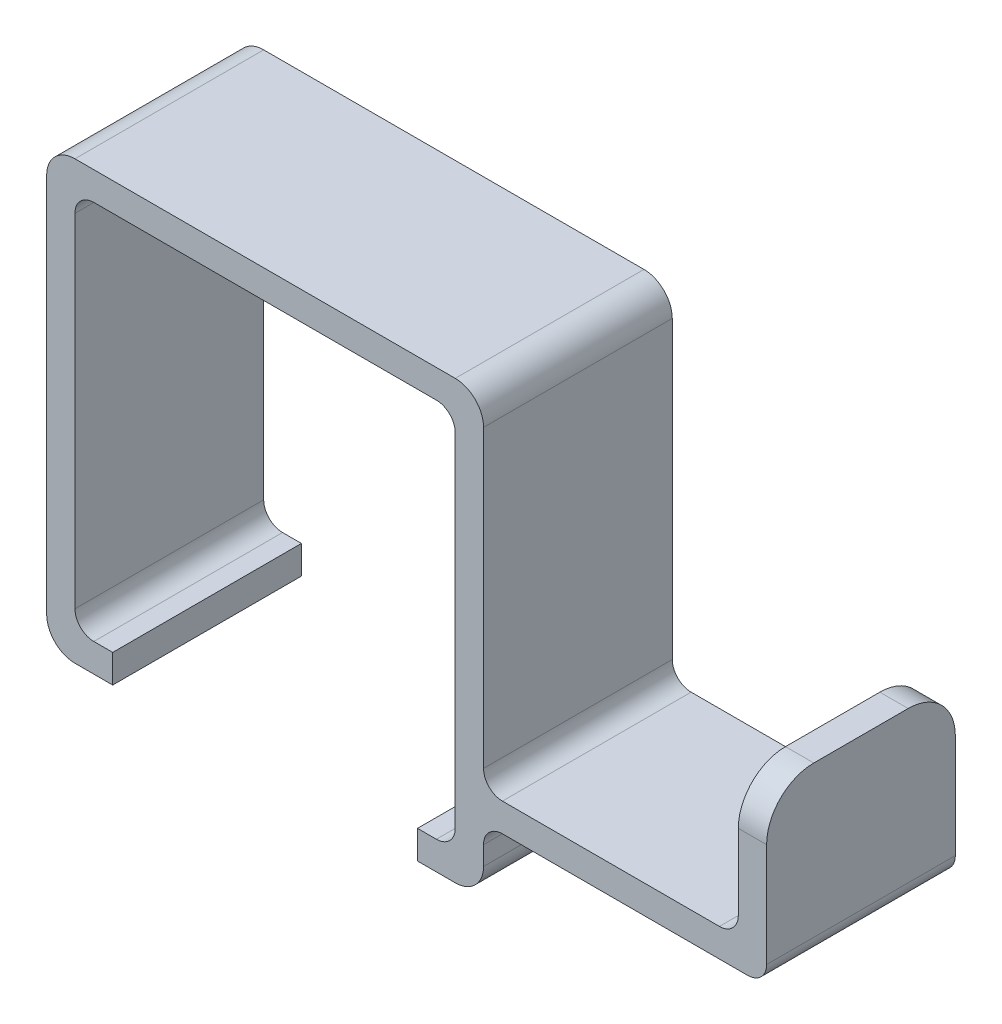
ISO-10303-21;
HEADER;
FILE_DESCRIPTION(('STEP AP214'),'2;1');
FILE_NAME('part.step','',(''),(''),'','','');
FILE_SCHEMA(('AUTOMOTIVE_DESIGN { 1 0 10303 214 1 1 1 1 }'));
ENDSEC;
DATA;
#1=APPLICATION_CONTEXT('core data for automotive mechanical design processes');
#2=APPLICATION_PROTOCOL_DEFINITION('international standard','automotive_design',2000,#1);
#3=PRODUCT_CONTEXT('',#1,'mechanical');
#4=PRODUCT('Part','Part','',(#3));
#5=PRODUCT_RELATED_PRODUCT_CATEGORY('part','',(#4));
#6=PRODUCT_DEFINITION_FORMATION('','',#4);
#7=PRODUCT_DEFINITION_CONTEXT('part definition',#1,'design');
#8=PRODUCT_DEFINITION('design','',#6,#7);
#9=PRODUCT_DEFINITION_SHAPE('','',#8);
#10=(LENGTH_UNIT() NAMED_UNIT(*) SI_UNIT(.MILLI.,.METRE.));
#11=(NAMED_UNIT(*) PLANE_ANGLE_UNIT() SI_UNIT($,.RADIAN.));
#12=(NAMED_UNIT(*) SI_UNIT($,.STERADIAN.) SOLID_ANGLE_UNIT());
#13=UNCERTAINTY_MEASURE_WITH_UNIT(LENGTH_MEASURE(1.E-05),#10,'distance_accuracy_value','');
#14=(GEOMETRIC_REPRESENTATION_CONTEXT(3) GLOBAL_UNCERTAINTY_ASSIGNED_CONTEXT((#13)) GLOBAL_UNIT_ASSIGNED_CONTEXT((#10,
#11,#12)) REPRESENTATION_CONTEXT('',''));
#15=CARTESIAN_POINT('',(0.,0.,0.));
#16=DIRECTION('',(0.,0.,1.));
#17=DIRECTION('',(1.,0.,0.));
#18=AXIS2_PLACEMENT_3D('',#15,#16,#17);
#19=CARTESIAN_POINT('',(73.3,17.,15.));
#20=DIRECTION('',(-1.,0.,0.));
#21=DIRECTION('',(0.,1.,0.));
#22=AXIS2_PLACEMENT_3D('',#19,#20,#21);
#23=CYLINDRICAL_SURFACE('',#22,5.);
#24=DIRECTION('',(-1.,0.,0.));
#25=VECTOR('',#24,1.);
#26=CARTESIAN_POINT('',(73.3,22.,15.));
#27=LINE('',#26,#25);
#28=CARTESIAN_POINT('',(73.3,22.,15.));
#29=VERTEX_POINT('',#28);
#30=CARTESIAN_POINT('',(70.3,22.,15.));
#31=VERTEX_POINT('',#30);
#32=EDGE_CURVE('E26',#29,#31,#27,.T.);
#33=ORIENTED_EDGE('',*,*,#32,.T.);
#34=CARTESIAN_POINT('',(70.3,17.,15.));
#35=DIRECTION('',(1.,0.,0.));
#36=DIRECTION('',(0.,0.,-1.));
#37=AXIS2_PLACEMENT_3D('',#34,#35,#36);
#38=CIRCLE('',#37,5.);
#39=CARTESIAN_POINT('',(70.3,17.,20.));
#40=VERTEX_POINT('',#39);
#41=EDGE_CURVE('E353',#31,#40,#38,.T.);
#42=ORIENTED_EDGE('',*,*,#41,.T.);
#43=DIRECTION('',(-1.,0.,0.));
#44=VECTOR('',#43,1.);
#45=CARTESIAN_POINT('',(73.3,17.,20.));
#46=LINE('',#45,#44);
#47=CARTESIAN_POINT('',(73.3,17.,20.));
#48=VERTEX_POINT('',#47);
#49=EDGE_CURVE('E11',#48,#40,#46,.T.);
#50=ORIENTED_EDGE('',*,*,#49,.F.);
#51=CARTESIAN_POINT('',(73.3,17.,15.));
#52=DIRECTION('',(1.,0.,0.));
#53=DIRECTION('',(0.,0.,-1.));
#54=AXIS2_PLACEMENT_3D('',#51,#52,#53);
#55=CIRCLE('',#54,5.);
#56=EDGE_CURVE('E356',#29,#48,#55,.T.);
#57=ORIENTED_EDGE('',*,*,#56,.F.);
#58=EDGE_LOOP('',(#33,#42,#50,#57));
#59=FACE_BOUND('',#58,.T.);
#60=ADVANCED_FACE('F17',(#59),#23,.T.);
#61=CARTESIAN_POINT('',(30.698150155831,20.862043767297,20.));
#62=DIRECTION('',(0.,0.,1.));
#63=DIRECTION('',(1.,0.,0.));
#64=AXIS2_PLACEMENT_3D('',#61,#62,#63);
#65=PLANE('',#64);
#66=DIRECTION('',(0.,1.,0.));
#67=VECTOR('',#66,1.);
#68=CARTESIAN_POINT('',(73.3,4.,20.));
#69=LINE('',#68,#67);
#70=CARTESIAN_POINT('',(73.3,6.,20.));
#71=VERTEX_POINT('',#70);
#72=EDGE_CURVE('E502',#71,#48,#69,.T.);
#73=ORIENTED_EDGE('',*,*,#72,.T.);
#74=ORIENTED_EDGE('',*,*,#49,.T.);
#75=DIRECTION('',(0.,-1.,0.));
#76=VECTOR('',#75,1.);
#77=CARTESIAN_POINT('',(70.3,22.,20.));
#78=LINE('',#77,#76);
#79=CARTESIAN_POINT('',(70.3,9.,20.));
#80=VERTEX_POINT('',#79);
#81=EDGE_CURVE('E372',#40,#80,#78,.T.);
#82=ORIENTED_EDGE('',*,*,#81,.T.);
#83=CARTESIAN_POINT('',(68.3,9.,20.));
#84=DIRECTION('',(0.,0.,-1.));
#85=DIRECTION('',(0.,-1.,0.));
#86=AXIS2_PLACEMENT_3D('',#83,#84,#85);
#87=CIRCLE('',#86,2.);
#88=CARTESIAN_POINT('',(68.3,7.,20.));
#89=VERTEX_POINT('',#88);
#90=EDGE_CURVE('E393',#80,#89,#87,.T.);
#91=ORIENTED_EDGE('',*,*,#90,.T.);
#92=DIRECTION('',(-1.,0.,0.));
#93=VECTOR('',#92,1.);
#94=CARTESIAN_POINT('',(73.3,7.,20.));
#95=LINE('',#94,#93);
#96=CARTESIAN_POINT('',(45.3,7.,20.));
#97=VERTEX_POINT('',#96);
#98=EDGE_CURVE('E382',#89,#97,#95,.T.);
#99=ORIENTED_EDGE('',*,*,#98,.T.);
#100=CARTESIAN_POINT('',(45.3,9.,20.));
#101=DIRECTION('',(0.,0.,-1.));
#102=DIRECTION('',(0.,-1.,0.));
#103=AXIS2_PLACEMENT_3D('',#100,#101,#102);
#104=CIRCLE('',#103,2.);
#105=CARTESIAN_POINT('',(43.3,9.,20.));
#106=VERTEX_POINT('',#105);
#107=EDGE_CURVE('E515',#97,#106,#104,.T.);
#108=ORIENTED_EDGE('',*,*,#107,.T.);
#109=DIRECTION('',(0.,1.,0.));
#110=VECTOR('',#109,1.);
#111=CARTESIAN_POINT('',(43.3,0.,20.));
#112=LINE('',#111,#110);
#113=CARTESIAN_POINT('',(43.3,40.3,20.));
#114=VERTEX_POINT('',#113);
#115=EDGE_CURVE('E417',#106,#114,#112,.T.);
#116=ORIENTED_EDGE('',*,*,#115,.T.);
#117=CARTESIAN_POINT('',(40.3,40.3,20.));
#118=DIRECTION('',(0.,0.,-1.));
#119=DIRECTION('',(-1.,0.,0.));
#120=AXIS2_PLACEMENT_3D('',#117,#118,#119);
#121=CIRCLE('',#120,3.);
#122=CARTESIAN_POINT('',(40.3,43.3,20.));
#123=VERTEX_POINT('',#122);
#124=EDGE_CURVE('E386',#123,#114,#121,.T.);
#125=ORIENTED_EDGE('',*,*,#124,.F.);
#126=DIRECTION('',(-1.,0.,0.));
#127=VECTOR('',#126,1.);
#128=CARTESIAN_POINT('',(40.3,43.3,20.));
#129=LINE('',#128,#127);
#130=CARTESIAN_POINT('',(0.,43.3,20.));
#131=VERTEX_POINT('',#130);
#132=EDGE_CURVE('E434',#123,#131,#129,.T.);
#133=ORIENTED_EDGE('',*,*,#132,.T.);
#134=CARTESIAN_POINT('',(0.,40.3,20.));
#135=DIRECTION('',(0.,0.,-1.));
#136=DIRECTION('',(0.,-1.,0.));
#137=AXIS2_PLACEMENT_3D('',#134,#135,#136);
#138=CIRCLE('',#137,3.);
#139=CARTESIAN_POINT('',(-3.,40.3,20.));
#140=VERTEX_POINT('',#139);
#141=EDGE_CURVE('E447',#140,#131,#138,.T.);
#142=ORIENTED_EDGE('',*,*,#141,.F.);
#143=DIRECTION('',(0.,-1.,0.));
#144=VECTOR('',#143,1.);
#145=CARTESIAN_POINT('',(-3.,40.3,20.));
#146=LINE('',#145,#144);
#147=CARTESIAN_POINT('',(-3.,0.,20.));
#148=VERTEX_POINT('',#147);
#149=EDGE_CURVE('E394',#140,#148,#146,.T.);
#150=ORIENTED_EDGE('',*,*,#149,.T.);
#151=CARTESIAN_POINT('',(0.,0.,20.));
#152=DIRECTION('',(0.,0.,-1.));
#153=DIRECTION('',(1.,0.,0.));
#154=AXIS2_PLACEMENT_3D('',#151,#152,#153);
#155=CIRCLE('',#154,3.);
#156=CARTESIAN_POINT('',(0.,-3.,20.));
#157=VERTEX_POINT('',#156);
#158=EDGE_CURVE('E456',#157,#148,#155,.T.);
#159=ORIENTED_EDGE('',*,*,#158,.F.);
#160=DIRECTION('',(-1.,0.,0.));
#161=VECTOR('',#160,1.);
#162=CARTESIAN_POINT('',(4.,-3.,20.));
#163=LINE('',#162,#161);
#164=CARTESIAN_POINT('',(4.,-3.,20.));
#165=VERTEX_POINT('',#164);
#166=EDGE_CURVE('E307',#165,#157,#163,.T.);
#167=ORIENTED_EDGE('',*,*,#166,.F.);
#168=DIRECTION('',(0.,-1.,0.));
#169=VECTOR('',#168,1.);
#170=CARTESIAN_POINT('',(4.,0.,20.));
#171=LINE('',#170,#169);
#172=CARTESIAN_POINT('',(4.,0.,20.));
#173=VERTEX_POINT('',#172);
#174=EDGE_CURVE('E304',#173,#165,#171,.T.);
#175=ORIENTED_EDGE('',*,*,#174,.F.);
#176=DIRECTION('',(1.,0.,0.));
#177=VECTOR('',#176,1.);
#178=CARTESIAN_POINT('',(0.,0.,20.));
#179=LINE('',#178,#177);
#180=CARTESIAN_POINT('',(2.,0.,20.));
#181=VERTEX_POINT('',#180);
#182=EDGE_CURVE('E292',#181,#173,#179,.T.);
#183=ORIENTED_EDGE('',*,*,#182,.F.);
#184=CARTESIAN_POINT('',(2.,2.,20.));
#185=DIRECTION('',(0.,0.,1.));
#186=DIRECTION('',(0.,-1.,0.));
#187=AXIS2_PLACEMENT_3D('',#184,#185,#186);
#188=CIRCLE('',#187,2.);
#189=CARTESIAN_POINT('',(0.,2.,20.));
#190=VERTEX_POINT('',#189);
#191=EDGE_CURVE('E38',#190,#181,#188,.T.);
#192=ORIENTED_EDGE('',*,*,#191,.F.);
#193=DIRECTION('',(0.,-1.,0.));
#194=VECTOR('',#193,1.);
#195=CARTESIAN_POINT('',(0.,40.3,20.));
#196=LINE('',#195,#194);
#197=CARTESIAN_POINT('',(0.,38.3,20.));
#198=VERTEX_POINT('',#197);
#199=EDGE_CURVE('E301',#198,#190,#196,.T.);
#200=ORIENTED_EDGE('',*,*,#199,.F.);
#201=CARTESIAN_POINT('',(2.,38.3,20.));
#202=DIRECTION('',(0.,0.,1.));
#203=DIRECTION('',(0.,-1.,0.));
#204=AXIS2_PLACEMENT_3D('',#201,#202,#203);
#205=CIRCLE('',#204,2.);
#206=CARTESIAN_POINT('',(2.,40.3,20.));
#207=VERTEX_POINT('',#206);
#208=EDGE_CURVE('E311',#207,#198,#205,.T.);
#209=ORIENTED_EDGE('',*,*,#208,.F.);
#210=DIRECTION('',(-1.,0.,0.));
#211=VECTOR('',#210,1.);
#212=CARTESIAN_POINT('',(40.3,40.3,20.));
#213=LINE('',#212,#211);
#214=CARTESIAN_POINT('',(38.3,40.3,20.));
#215=VERTEX_POINT('',#214);
#216=EDGE_CURVE('E325',#215,#207,#213,.T.);
#217=ORIENTED_EDGE('',*,*,#216,.F.);
#218=CARTESIAN_POINT('',(38.3,38.3,20.));
#219=DIRECTION('',(0.,0.,1.));
#220=DIRECTION('',(0.,-1.,0.));
#221=AXIS2_PLACEMENT_3D('',#218,#219,#220);
#222=CIRCLE('',#221,2.);
#223=CARTESIAN_POINT('',(40.3,38.3,20.));
#224=VERTEX_POINT('',#223);
#225=EDGE_CURVE('E459',#224,#215,#222,.T.);
#226=ORIENTED_EDGE('',*,*,#225,.F.);
#227=DIRECTION('',(0.,1.,0.));
#228=VECTOR('',#227,1.);
#229=CARTESIAN_POINT('',(40.3,0.,20.));
#230=LINE('',#229,#228);
#231=CARTESIAN_POINT('',(40.3,2.,20.));
#232=VERTEX_POINT('',#231);
#233=EDGE_CURVE('E398',#232,#224,#230,.T.);
#234=ORIENTED_EDGE('',*,*,#233,.F.);
#235=CARTESIAN_POINT('',(38.3,2.,20.));
#236=DIRECTION('',(0.,0.,1.));
#237=DIRECTION('',(0.,-1.,0.));
#238=AXIS2_PLACEMENT_3D('',#235,#236,#237);
#239=CIRCLE('',#238,2.);
#240=CARTESIAN_POINT('',(38.3,0.,20.));
#241=VERTEX_POINT('',#240);
#242=EDGE_CURVE('E416',#241,#232,#239,.T.);
#243=ORIENTED_EDGE('',*,*,#242,.F.);
#244=DIRECTION('',(-1.,0.,0.));
#245=VECTOR('',#244,1.);
#246=CARTESIAN_POINT('',(40.3,0.,20.));
#247=LINE('',#246,#245);
#248=CARTESIAN_POINT('',(36.3,0.,20.));
#249=VERTEX_POINT('',#248);
#250=EDGE_CURVE('E436',#241,#249,#247,.T.);
#251=ORIENTED_EDGE('',*,*,#250,.T.);
#252=DIRECTION('',(0.,-1.,0.));
#253=VECTOR('',#252,1.);
#254=CARTESIAN_POINT('',(36.3,0.,20.));
#255=LINE('',#254,#253);
#256=CARTESIAN_POINT('',(36.3,-3.,20.));
#257=VERTEX_POINT('',#256);
#258=EDGE_CURVE('E429',#249,#257,#255,.T.);
#259=ORIENTED_EDGE('',*,*,#258,.T.);
#260=DIRECTION('',(1.,0.,0.));
#261=VECTOR('',#260,1.);
#262=CARTESIAN_POINT('',(36.3,-3.,20.));
#263=LINE('',#262,#261);
#264=CARTESIAN_POINT('',(40.3,-3.,20.));
#265=VERTEX_POINT('',#264);
#266=EDGE_CURVE('E426',#257,#265,#263,.T.);
#267=ORIENTED_EDGE('',*,*,#266,.T.);
#268=CARTESIAN_POINT('',(40.3,0.,20.));
#269=DIRECTION('',(0.,0.,-1.));
#270=DIRECTION('',(0.,1.,0.));
#271=AXIS2_PLACEMENT_3D('',#268,#269,#270);
#272=CIRCLE('',#271,3.);
#273=CARTESIAN_POINT('',(43.3,0.,20.));
#274=VERTEX_POINT('',#273);
#275=EDGE_CURVE('E511',#274,#265,#272,.T.);
#276=ORIENTED_EDGE('',*,*,#275,.F.);
#277=DIRECTION('',(0.,1.,0.));
#278=VECTOR('',#277,1.);
#279=CARTESIAN_POINT('',(43.3,0.,20.));
#280=LINE('',#279,#278);
#281=CARTESIAN_POINT('',(43.3,2.,20.));
#282=VERTEX_POINT('',#281);
#283=EDGE_CURVE('E404',#274,#282,#280,.T.);
#284=ORIENTED_EDGE('',*,*,#283,.T.);
#285=CARTESIAN_POINT('',(45.3,2.,20.));
#286=DIRECTION('',(0.,0.,-1.));
#287=DIRECTION('',(0.,-1.,0.));
#288=AXIS2_PLACEMENT_3D('',#285,#286,#287);
#289=CIRCLE('',#288,2.);
#290=CARTESIAN_POINT('',(45.3,4.,20.));
#291=VERTEX_POINT('',#290);
#292=EDGE_CURVE('E389',#282,#291,#289,.T.);
#293=ORIENTED_EDGE('',*,*,#292,.T.);
#294=DIRECTION('',(1.,0.,0.));
#295=VECTOR('',#294,1.);
#296=CARTESIAN_POINT('',(43.3,4.,20.));
#297=LINE('',#296,#295);
#298=CARTESIAN_POINT('',(71.3,4.,20.));
#299=VERTEX_POINT('',#298);
#300=EDGE_CURVE('E367',#291,#299,#297,.T.);
#301=ORIENTED_EDGE('',*,*,#300,.T.);
#302=CARTESIAN_POINT('',(71.3,6.,20.));
#303=DIRECTION('',(0.,0.,1.));
#304=DIRECTION('',(0.,-1.,0.));
#305=AXIS2_PLACEMENT_3D('',#302,#303,#304);
#306=CIRCLE('',#305,2.);
#307=EDGE_CURVE('E538',#299,#71,#306,.T.);
#308=ORIENTED_EDGE('',*,*,#307,.T.);
#309=EDGE_LOOP('',(#73,#74,#82,#91,#99,#108,#116,#125,#133,#142,#150,#159,#167,#175,#183,#192,
#200,#209,#217,#226,#234,#243,#251,#259,#267,#276,#284,#293,#301,#308));
#310=FACE_BOUND('',#309,.T.);
#311=ADVANCED_FACE('F19',(#310),#65,.T.);
#312=CARTESIAN_POINT('',(73.3,22.,0.));
#313=DIRECTION('',(0.,-1.,0.));
#314=DIRECTION('',(0.,0.,-1.));
#315=AXIS2_PLACEMENT_3D('',#312,#313,#314);
#316=PLANE('',#315);
#317=DIRECTION('',(-1.,0.,0.));
#318=VECTOR('',#317,1.);
#319=CARTESIAN_POINT('',(73.3,22.,5.));
#320=LINE('',#319,#318);
#321=CARTESIAN_POINT('',(73.3,22.,5.));
#322=VERTEX_POINT('',#321);
#323=CARTESIAN_POINT('',(70.3,22.,5.));
#324=VERTEX_POINT('',#323);
#325=EDGE_CURVE('E363',#322,#324,#320,.T.);
#326=ORIENTED_EDGE('',*,*,#325,.T.);
#327=DIRECTION('',(0.,0.,1.));
#328=VECTOR('',#327,1.);
#329=CARTESIAN_POINT('',(70.3,22.,0.));
#330=LINE('',#329,#328);
#331=EDGE_CURVE('E361',#324,#31,#330,.T.);
#332=ORIENTED_EDGE('',*,*,#331,.T.);
#333=ORIENTED_EDGE('',*,*,#32,.F.);
#334=DIRECTION('',(0.,0.,1.));
#335=VECTOR('',#334,1.);
#336=CARTESIAN_POINT('',(73.3,22.,0.));
#337=LINE('',#336,#335);
#338=EDGE_CURVE('E503',#322,#29,#337,.T.);
#339=ORIENTED_EDGE('',*,*,#338,.F.);
#340=EDGE_LOOP('',(#326,#332,#333,#339));
#341=FACE_BOUND('',#340,.T.);
#342=ADVANCED_FACE('F362',(#341),#316,.F.);
#343=CARTESIAN_POINT('',(2.,2.,0.));
#344=DIRECTION('',(0.,0.,1.));
#345=DIRECTION('',(-1.,0.,0.));
#346=AXIS2_PLACEMENT_3D('',#343,#344,#345);
#347=CYLINDRICAL_SURFACE('',#346,2.);
#348=DIRECTION('',(0.,0.,1.));
#349=VECTOR('',#348,1.);
#350=CARTESIAN_POINT('',(0.,2.,0.));
#351=LINE('',#350,#349);
#352=CARTESIAN_POINT('',(0.,2.,0.));
#353=VERTEX_POINT('',#352);
#354=EDGE_CURVE('E341',#353,#190,#351,.T.);
#355=ORIENTED_EDGE('',*,*,#354,.T.);
#356=ORIENTED_EDGE('',*,*,#191,.T.);
#357=DIRECTION('',(0.,0.,1.));
#358=VECTOR('',#357,1.);
#359=CARTESIAN_POINT('',(2.,0.,0.));
#360=LINE('',#359,#358);
#361=CARTESIAN_POINT('',(2.,0.,0.));
#362=VERTEX_POINT('',#361);
#363=EDGE_CURVE('E299',#362,#181,#360,.T.);
#364=ORIENTED_EDGE('',*,*,#363,.F.);
#365=CARTESIAN_POINT('',(2.,2.,0.));
#366=DIRECTION('',(0.,0.,1.));
#367=DIRECTION('',(0.,-1.,0.));
#368=AXIS2_PLACEMENT_3D('',#365,#366,#367);
#369=CIRCLE('',#368,2.);
#370=EDGE_CURVE('E594',#353,#362,#369,.T.);
#371=ORIENTED_EDGE('',*,*,#370,.F.);
#372=EDGE_LOOP('',(#355,#356,#364,#371));
#373=FACE_BOUND('',#372,.T.);
#374=ADVANCED_FACE('F969',(#373),#347,.F.);
#375=CARTESIAN_POINT('',(0.,40.3,0.));
#376=DIRECTION('',(1.,0.,0.));
#377=DIRECTION('',(0.,1.,0.));
#378=AXIS2_PLACEMENT_3D('',#375,#376,#377);
#379=PLANE('',#378);
#380=DIRECTION('',(0.,-1.,0.));
#381=VECTOR('',#380,1.);
#382=CARTESIAN_POINT('',(0.,40.3,0.));
#383=LINE('',#382,#381);
#384=CARTESIAN_POINT('',(0.,38.3,0.));
#385=VERTEX_POINT('',#384);
#386=EDGE_CURVE('E595',#385,#353,#383,.T.);
#387=ORIENTED_EDGE('',*,*,#386,.F.);
#388=DIRECTION('',(0.,0.,1.));
#389=VECTOR('',#388,1.);
#390=CARTESIAN_POINT('',(0.,38.3,0.));
#391=LINE('',#390,#389);
#392=EDGE_CURVE('E332',#385,#198,#391,.T.);
#393=ORIENTED_EDGE('',*,*,#392,.T.);
#394=ORIENTED_EDGE('',*,*,#199,.T.);
#395=ORIENTED_EDGE('',*,*,#354,.F.);
#396=EDGE_LOOP('',(#387,#393,#394,#395));
#397=FACE_BOUND('',#396,.T.);
#398=ADVANCED_FACE('F1139',(#397),#379,.T.);
#399=CARTESIAN_POINT('',(0.,0.,0.));
#400=DIRECTION('',(0.,1.,0.));
#401=DIRECTION('',(1.,0.,0.));
#402=AXIS2_PLACEMENT_3D('',#399,#400,#401);
#403=PLANE('',#402);
#404=DIRECTION('',(1.,0.,0.));
#405=VECTOR('',#404,1.);
#406=CARTESIAN_POINT('',(0.,0.,0.));
#407=LINE('',#406,#405);
#408=CARTESIAN_POINT('',(4.,0.,0.));
#409=VERTEX_POINT('',#408);
#410=EDGE_CURVE('E591',#362,#409,#407,.T.);
#411=ORIENTED_EDGE('',*,*,#410,.F.);
#412=ORIENTED_EDGE('',*,*,#363,.T.);
#413=ORIENTED_EDGE('',*,*,#182,.T.);
#414=DIRECTION('',(0.,0.,1.));
#415=VECTOR('',#414,1.);
#416=CARTESIAN_POINT('',(4.,0.,0.));
#417=LINE('',#416,#415);
#418=EDGE_CURVE('E297',#409,#173,#417,.T.);
#419=ORIENTED_EDGE('',*,*,#418,.F.);
#420=EDGE_LOOP('',(#411,#412,#413,#419));
#421=FACE_BOUND('',#420,.T.);
#422=ADVANCED_FACE('F295',(#421),#403,.T.);
#423=CARTESIAN_POINT('',(2.,38.3,0.));
#424=DIRECTION('',(0.,0.,1.));
#425=DIRECTION('',(0.,1.,0.));
#426=AXIS2_PLACEMENT_3D('',#423,#424,#425);
#427=CYLINDRICAL_SURFACE('',#426,2.);
#428=DIRECTION('',(0.,0.,1.));
#429=VECTOR('',#428,1.);
#430=CARTESIAN_POINT('',(2.,40.3,0.));
#431=LINE('',#430,#429);
#432=CARTESIAN_POINT('',(2.,40.3,0.));
#433=VERTEX_POINT('',#432);
#434=EDGE_CURVE('E318',#433,#207,#431,.T.);
#435=ORIENTED_EDGE('',*,*,#434,.T.);
#436=ORIENTED_EDGE('',*,*,#208,.T.);
#437=ORIENTED_EDGE('',*,*,#392,.F.);
#438=CARTESIAN_POINT('',(2.,38.3,0.));
#439=DIRECTION('',(0.,0.,1.));
#440=DIRECTION('',(0.,-1.,0.));
#441=AXIS2_PLACEMENT_3D('',#438,#439,#440);
#442=CIRCLE('',#441,2.);
#443=EDGE_CURVE('E599',#433,#385,#442,.T.);
#444=ORIENTED_EDGE('',*,*,#443,.F.);
#445=EDGE_LOOP('',(#435,#436,#437,#444));
#446=FACE_BOUND('',#445,.T.);
#447=ADVANCED_FACE('F1119',(#446),#427,.F.);
#448=CARTESIAN_POINT('',(4.,0.,0.));
#449=DIRECTION('',(1.,0.,0.));
#450=DIRECTION('',(0.,1.,0.));
#451=AXIS2_PLACEMENT_3D('',#448,#449,#450);
#452=PLANE('',#451);
#453=ORIENTED_EDGE('',*,*,#418,.T.);
#454=ORIENTED_EDGE('',*,*,#174,.T.);
#455=DIRECTION('',(0.,0.,1.));
#456=VECTOR('',#455,1.);
#457=CARTESIAN_POINT('',(4.,-3.,0.));
#458=LINE('',#457,#456);
#459=CARTESIAN_POINT('',(4.,-3.,0.));
#460=VERTEX_POINT('',#459);
#461=EDGE_CURVE('E474',#460,#165,#458,.T.);
#462=ORIENTED_EDGE('',*,*,#461,.F.);
#463=DIRECTION('',(0.,-1.,0.));
#464=VECTOR('',#463,1.);
#465=CARTESIAN_POINT('',(4.,0.,0.));
#466=LINE('',#465,#464);
#467=EDGE_CURVE('E315',#409,#460,#466,.T.);
#468=ORIENTED_EDGE('',*,*,#467,.F.);
#469=EDGE_LOOP('',(#453,#454,#462,#468));
#470=FACE_BOUND('',#469,.T.);
#471=ADVANCED_FACE('F313',(#470),#452,.T.);
#472=CARTESIAN_POINT('',(40.3,40.3,0.));
#473=DIRECTION('',(0.,-1.,0.));
#474=DIRECTION('',(0.,0.,-1.));
#475=AXIS2_PLACEMENT_3D('',#472,#473,#474);
#476=PLANE('',#475);
#477=DIRECTION('',(-1.,0.,0.));
#478=VECTOR('',#477,1.);
#479=CARTESIAN_POINT('',(40.3,40.3,0.));
#480=LINE('',#479,#478);
#481=CARTESIAN_POINT('',(38.3,40.3,0.));
#482=VERTEX_POINT('',#481);
#483=EDGE_CURVE('E608',#482,#433,#480,.T.);
#484=ORIENTED_EDGE('',*,*,#483,.F.);
#485=DIRECTION('',(0.,0.,1.));
#486=VECTOR('',#485,1.);
#487=CARTESIAN_POINT('',(38.3,40.3,0.));
#488=LINE('',#487,#486);
#489=EDGE_CURVE('E473',#482,#215,#488,.T.);
#490=ORIENTED_EDGE('',*,*,#489,.T.);
#491=ORIENTED_EDGE('',*,*,#216,.T.);
#492=ORIENTED_EDGE('',*,*,#434,.F.);
#493=EDGE_LOOP('',(#484,#490,#491,#492));
#494=FACE_BOUND('',#493,.T.);
#495=ADVANCED_FACE('F1091',(#494),#476,.T.);
#496=CARTESIAN_POINT('',(4.,-3.,0.));
#497=DIRECTION('',(0.,-1.,0.));
#498=DIRECTION('',(-1.,0.,0.));
#499=AXIS2_PLACEMENT_3D('',#496,#497,#498);
#500=PLANE('',#499);
#501=ORIENTED_EDGE('',*,*,#461,.T.);
#502=ORIENTED_EDGE('',*,*,#166,.T.);
#503=DIRECTION('',(0.,0.,1.));
#504=VECTOR('',#503,1.);
#505=CARTESIAN_POINT('',(0.,-3.,0.));
#506=LINE('',#505,#504);
#507=CARTESIAN_POINT('',(0.,-3.,0.));
#508=VERTEX_POINT('',#507);
#509=EDGE_CURVE('E460',#508,#157,#506,.T.);
#510=ORIENTED_EDGE('',*,*,#509,.F.);
#511=DIRECTION('',(-1.,0.,0.));
#512=VECTOR('',#511,1.);
#513=CARTESIAN_POINT('',(4.,-3.,0.));
#514=LINE('',#513,#512);
#515=EDGE_CURVE('E625',#460,#508,#514,.T.);
#516=ORIENTED_EDGE('',*,*,#515,.F.);
#517=EDGE_LOOP('',(#501,#502,#510,#516));
#518=FACE_BOUND('',#517,.T.);
#519=ADVANCED_FACE('F724',(#518),#500,.T.);
#520=CARTESIAN_POINT('',(38.3,38.3,0.));
#521=DIRECTION('',(0.,0.,1.));
#522=DIRECTION('',(1.,0.,0.));
#523=AXIS2_PLACEMENT_3D('',#520,#521,#522);
#524=CYLINDRICAL_SURFACE('',#523,2.);
#525=DIRECTION('',(0.,0.,1.));
#526=VECTOR('',#525,1.);
#527=CARTESIAN_POINT('',(40.3,38.3,0.));
#528=LINE('',#527,#526);
#529=CARTESIAN_POINT('',(40.3,38.3,0.));
#530=VERTEX_POINT('',#529);
#531=EDGE_CURVE('E464',#530,#224,#528,.T.);
#532=ORIENTED_EDGE('',*,*,#531,.T.);
#533=ORIENTED_EDGE('',*,*,#225,.T.);
#534=ORIENTED_EDGE('',*,*,#489,.F.);
#535=CARTESIAN_POINT('',(38.3,38.3,0.));
#536=DIRECTION('',(0.,0.,1.));
#537=DIRECTION('',(0.,-1.,0.));
#538=AXIS2_PLACEMENT_3D('',#535,#536,#537);
#539=CIRCLE('',#538,2.);
#540=EDGE_CURVE('E604',#530,#482,#539,.T.);
#541=ORIENTED_EDGE('',*,*,#540,.F.);
#542=EDGE_LOOP('',(#532,#533,#534,#541));
#543=FACE_BOUND('',#542,.T.);
#544=ADVANCED_FACE('F1071',(#543),#524,.F.);
#545=CARTESIAN_POINT('',(0.,0.,0.));
#546=DIRECTION('',(0.,0.,-1.));
#547=DIRECTION('',(1.,0.,0.));
#548=AXIS2_PLACEMENT_3D('',#545,#546,#547);
#549=CYLINDRICAL_SURFACE('',#548,3.);
#550=ORIENTED_EDGE('',*,*,#509,.T.);
#551=ORIENTED_EDGE('',*,*,#158,.T.);
#552=DIRECTION('',(0.,0.,1.));
#553=VECTOR('',#552,1.);
#554=CARTESIAN_POINT('',(-3.,0.,0.));
#555=LINE('',#554,#553);
#556=CARTESIAN_POINT('',(-3.,0.,0.));
#557=VERTEX_POINT('',#556);
#558=EDGE_CURVE('E399',#557,#148,#555,.T.);
#559=ORIENTED_EDGE('',*,*,#558,.F.);
#560=CARTESIAN_POINT('',(0.,0.,0.));
#561=DIRECTION('',(0.,0.,-1.));
#562=DIRECTION('',(1.,0.,0.));
#563=AXIS2_PLACEMENT_3D('',#560,#561,#562);
#564=CIRCLE('',#563,3.);
#565=EDGE_CURVE('E630',#508,#557,#564,.T.);
#566=ORIENTED_EDGE('',*,*,#565,.F.);
#567=EDGE_LOOP('',(#550,#551,#559,#566));
#568=FACE_BOUND('',#567,.T.);
#569=ADVANCED_FACE('F723',(#568),#549,.T.);
#570=CARTESIAN_POINT('',(40.3,0.,0.));
#571=DIRECTION('',(-1.,0.,0.));
#572=DIRECTION('',(0.,0.,1.));
#573=AXIS2_PLACEMENT_3D('',#570,#571,#572);
#574=PLANE('',#573);
#575=DIRECTION('',(0.,1.,0.));
#576=VECTOR('',#575,1.);
#577=CARTESIAN_POINT('',(40.3,0.,0.));
#578=LINE('',#577,#576);
#579=CARTESIAN_POINT('',(40.3,2.,0.));
#580=VERTEX_POINT('',#579);
#581=EDGE_CURVE('E600',#580,#530,#578,.T.);
#582=ORIENTED_EDGE('',*,*,#581,.F.);
#583=DIRECTION('',(0.,0.,1.));
#584=VECTOR('',#583,1.);
#585=CARTESIAN_POINT('',(40.3,2.,0.));
#586=LINE('',#585,#584);
#587=EDGE_CURVE('E412',#580,#232,#586,.T.);
#588=ORIENTED_EDGE('',*,*,#587,.T.);
#589=ORIENTED_EDGE('',*,*,#233,.T.);
#590=ORIENTED_EDGE('',*,*,#531,.F.);
#591=EDGE_LOOP('',(#582,#588,#589,#590));
#592=FACE_BOUND('',#591,.T.);
#593=ADVANCED_FACE('F1051',(#592),#574,.T.);
#594=CARTESIAN_POINT('',(-3.,40.3,0.));
#595=DIRECTION('',(1.,0.,0.));
#596=DIRECTION('',(0.,1.,0.));
#597=AXIS2_PLACEMENT_3D('',#594,#595,#596);
#598=PLANE('',#597);
#599=DIRECTION('',(0.,-1.,0.));
#600=VECTOR('',#599,1.);
#601=CARTESIAN_POINT('',(-3.,40.3,0.));
#602=LINE('',#601,#600);
#603=CARTESIAN_POINT('',(-3.,40.3,0.));
#604=VERTEX_POINT('',#603);
#605=EDGE_CURVE('E635',#604,#557,#602,.T.);
#606=ORIENTED_EDGE('',*,*,#605,.T.);
#607=ORIENTED_EDGE('',*,*,#558,.T.);
#608=ORIENTED_EDGE('',*,*,#149,.F.);
#609=DIRECTION('',(0.,0.,1.));
#610=VECTOR('',#609,1.);
#611=CARTESIAN_POINT('',(-3.,40.3,0.));
#612=LINE('',#611,#610);
#613=EDGE_CURVE('E446',#604,#140,#612,.T.);
#614=ORIENTED_EDGE('',*,*,#613,.F.);
#615=EDGE_LOOP('',(#606,#607,#608,#614));
#616=FACE_BOUND('',#615,.T.);
#617=ADVANCED_FACE('F718',(#616),#598,.F.);
#618=CARTESIAN_POINT('',(38.3,2.,0.));
#619=DIRECTION('',(0.,0.,1.));
#620=DIRECTION('',(0.,-1.,0.));
#621=AXIS2_PLACEMENT_3D('',#618,#619,#620);
#622=CYLINDRICAL_SURFACE('',#621,2.);
#623=DIRECTION('',(0.,0.,1.));
#624=VECTOR('',#623,1.);
#625=CARTESIAN_POINT('',(38.3,0.,0.));
#626=LINE('',#625,#624);
#627=CARTESIAN_POINT('',(38.3,0.,0.));
#628=VERTEX_POINT('',#627);
#629=EDGE_CURVE('E439',#628,#241,#626,.T.);
#630=ORIENTED_EDGE('',*,*,#629,.T.);
#631=ORIENTED_EDGE('',*,*,#242,.T.);
#632=ORIENTED_EDGE('',*,*,#587,.F.);
#633=CARTESIAN_POINT('',(38.3,2.,0.));
#634=DIRECTION('',(0.,0.,1.));
#635=DIRECTION('',(0.,-1.,0.));
#636=AXIS2_PLACEMENT_3D('',#633,#634,#635);
#637=CIRCLE('',#636,2.);
#638=EDGE_CURVE('E585',#628,#580,#637,.T.);
#639=ORIENTED_EDGE('',*,*,#638,.F.);
#640=EDGE_LOOP('',(#630,#631,#632,#639));
#641=FACE_BOUND('',#640,.T.);
#642=ADVANCED_FACE('F930',(#641),#622,.F.);
#643=CARTESIAN_POINT('',(0.,40.3,0.));
#644=DIRECTION('',(0.,0.,-1.));
#645=DIRECTION('',(0.,-1.,0.));
#646=AXIS2_PLACEMENT_3D('',#643,#644,#645);
#647=CYLINDRICAL_SURFACE('',#646,3.);
#648=ORIENTED_EDGE('',*,*,#613,.T.);
#649=ORIENTED_EDGE('',*,*,#141,.T.);
#650=DIRECTION('',(0.,0.,1.));
#651=VECTOR('',#650,1.);
#652=CARTESIAN_POINT('',(0.,43.3,0.));
#653=LINE('',#652,#651);
#654=CARTESIAN_POINT('',(0.,43.3,0.));
#655=VERTEX_POINT('',#654);
#656=EDGE_CURVE('E430',#655,#131,#653,.T.);
#657=ORIENTED_EDGE('',*,*,#656,.F.);
#658=CARTESIAN_POINT('',(0.,40.3,0.));
#659=DIRECTION('',(0.,0.,-1.));
#660=DIRECTION('',(0.,-1.,0.));
#661=AXIS2_PLACEMENT_3D('',#658,#659,#660);
#662=CIRCLE('',#661,3.);
#663=EDGE_CURVE('E639',#604,#655,#662,.T.);
#664=ORIENTED_EDGE('',*,*,#663,.F.);
#665=EDGE_LOOP('',(#648,#649,#657,#664));
#666=FACE_BOUND('',#665,.T.);
#667=ADVANCED_FACE('F714',(#666),#647,.T.);
#668=CARTESIAN_POINT('',(40.3,0.,0.));
#669=DIRECTION('',(0.,-1.,0.));
#670=DIRECTION('',(0.,0.,-1.));
#671=AXIS2_PLACEMENT_3D('',#668,#669,#670);
#672=PLANE('',#671);
#673=DIRECTION('',(0.,0.,1.));
#674=VECTOR('',#673,1.);
#675=CARTESIAN_POINT('',(36.3,0.,0.));
#676=LINE('',#675,#674);
#677=CARTESIAN_POINT('',(36.3,0.,0.));
#678=VERTEX_POINT('',#677);
#679=EDGE_CURVE('E435',#678,#249,#676,.T.);
#680=ORIENTED_EDGE('',*,*,#679,.T.);
#681=ORIENTED_EDGE('',*,*,#250,.F.);
#682=ORIENTED_EDGE('',*,*,#629,.F.);
#683=DIRECTION('',(-1.,0.,0.));
#684=VECTOR('',#683,1.);
#685=CARTESIAN_POINT('',(40.3,0.,0.));
#686=LINE('',#685,#684);
#687=EDGE_CURVE('E581',#628,#678,#686,.T.);
#688=ORIENTED_EDGE('',*,*,#687,.T.);
#689=EDGE_LOOP('',(#680,#681,#682,#688));
#690=FACE_BOUND('',#689,.T.);
#691=ADVANCED_FACE('F929',(#690),#672,.F.);
#692=CARTESIAN_POINT('',(40.3,43.3,0.));
#693=DIRECTION('',(0.,-1.,0.));
#694=DIRECTION('',(0.,0.,-1.));
#695=AXIS2_PLACEMENT_3D('',#692,#693,#694);
#696=PLANE('',#695);
#697=DIRECTION('',(-1.,0.,0.));
#698=VECTOR('',#697,1.);
#699=CARTESIAN_POINT('',(40.3,43.3,0.));
#700=LINE('',#699,#698);
#701=CARTESIAN_POINT('',(40.3,43.3,0.));
#702=VERTEX_POINT('',#701);
#703=EDGE_CURVE('E645',#702,#655,#700,.T.);
#704=ORIENTED_EDGE('',*,*,#703,.T.);
#705=ORIENTED_EDGE('',*,*,#656,.T.);
#706=ORIENTED_EDGE('',*,*,#132,.F.);
#707=DIRECTION('',(0.,0.,1.));
#708=VECTOR('',#707,1.);
#709=CARTESIAN_POINT('',(40.3,43.3,0.));
#710=LINE('',#709,#708);
#711=EDGE_CURVE('E383',#702,#123,#710,.T.);
#712=ORIENTED_EDGE('',*,*,#711,.F.);
#713=EDGE_LOOP('',(#704,#705,#706,#712));
#714=FACE_BOUND('',#713,.T.);
#715=ADVANCED_FACE('F720',(#714),#696,.F.);
#716=CARTESIAN_POINT('',(36.3,0.,0.));
#717=DIRECTION('',(1.,0.,0.));
#718=DIRECTION('',(0.,1.,0.));
#719=AXIS2_PLACEMENT_3D('',#716,#717,#718);
#720=PLANE('',#719);
#721=DIRECTION('',(0.,-1.,0.));
#722=VECTOR('',#721,1.);
#723=CARTESIAN_POINT('',(36.3,0.,0.));
#724=LINE('',#723,#722);
#725=CARTESIAN_POINT('',(36.3,-3.,0.));
#726=VERTEX_POINT('',#725);
#727=EDGE_CURVE('E586',#678,#726,#724,.T.);
#728=ORIENTED_EDGE('',*,*,#727,.T.);
#729=DIRECTION('',(0.,0.,1.));
#730=VECTOR('',#729,1.);
#731=CARTESIAN_POINT('',(36.3,-3.,0.));
#732=LINE('',#731,#730);
#733=EDGE_CURVE('E387',#726,#257,#732,.T.);
#734=ORIENTED_EDGE('',*,*,#733,.T.);
#735=ORIENTED_EDGE('',*,*,#258,.F.);
#736=ORIENTED_EDGE('',*,*,#679,.F.);
#737=EDGE_LOOP('',(#728,#734,#735,#736));
#738=FACE_BOUND('',#737,.T.);
#739=ADVANCED_FACE('F859',(#738),#720,.F.);
#740=CARTESIAN_POINT('',(40.3,40.3,0.));
#741=DIRECTION('',(0.,0.,-1.));
#742=DIRECTION('',(-1.,0.,0.));
#743=AXIS2_PLACEMENT_3D('',#740,#741,#742);
#744=CYLINDRICAL_SURFACE('',#743,3.);
#745=ORIENTED_EDGE('',*,*,#711,.T.);
#746=ORIENTED_EDGE('',*,*,#124,.T.);
#747=DIRECTION('',(0.,0.,1.));
#748=VECTOR('',#747,1.);
#749=CARTESIAN_POINT('',(43.3,40.3,0.));
#750=LINE('',#749,#748);
#751=CARTESIAN_POINT('',(43.3,40.3,0.));
#752=VERTEX_POINT('',#751);
#753=EDGE_CURVE('E421',#752,#114,#750,.T.);
#754=ORIENTED_EDGE('',*,*,#753,.F.);
#755=CARTESIAN_POINT('',(40.3,40.3,0.));
#756=DIRECTION('',(0.,0.,-1.));
#757=DIRECTION('',(-1.,0.,0.));
#758=AXIS2_PLACEMENT_3D('',#755,#756,#757);
#759=CIRCLE('',#758,3.);
#760=EDGE_CURVE('E622',#702,#752,#759,.T.);
#761=ORIENTED_EDGE('',*,*,#760,.F.);
#762=EDGE_LOOP('',(#745,#746,#754,#761));
#763=FACE_BOUND('',#762,.T.);
#764=ADVANCED_FACE('F659',(#763),#744,.T.);
#765=CARTESIAN_POINT('',(36.3,-3.,0.));
#766=DIRECTION('',(0.,1.,0.));
#767=DIRECTION('',(1.,0.,0.));
#768=AXIS2_PLACEMENT_3D('',#765,#766,#767);
#769=PLANE('',#768);
#770=DIRECTION('',(1.,0.,0.));
#771=VECTOR('',#770,1.);
#772=CARTESIAN_POINT('',(36.3,-3.,0.));
#773=LINE('',#772,#771);
#774=CARTESIAN_POINT('',(40.3,-3.,0.));
#775=VERTEX_POINT('',#774);
#776=EDGE_CURVE('E590',#726,#775,#773,.T.);
#777=ORIENTED_EDGE('',*,*,#776,.T.);
#778=DIRECTION('',(0.,0.,1.));
#779=VECTOR('',#778,1.);
#780=CARTESIAN_POINT('',(40.3,-3.,0.));
#781=LINE('',#780,#779);
#782=EDGE_CURVE('E422',#775,#265,#781,.T.);
#783=ORIENTED_EDGE('',*,*,#782,.T.);
#784=ORIENTED_EDGE('',*,*,#266,.F.);
#785=ORIENTED_EDGE('',*,*,#733,.F.);
#786=EDGE_LOOP('',(#777,#783,#784,#785));
#787=FACE_BOUND('',#786,.T.);
#788=ADVANCED_FACE('F997',(#787),#769,.F.);
#789=CARTESIAN_POINT('',(43.3,20.15,10.));
#790=DIRECTION('',(1.,0.,0.));
#791=DIRECTION('',(0.,1.,0.));
#792=AXIS2_PLACEMENT_3D('',#789,#790,#791);
#793=PLANE('',#792);
#794=ORIENTED_EDGE('',*,*,#115,.F.);
#795=DIRECTION('',(0.,0.,1.));
#796=VECTOR('',#795,1.);
#797=CARTESIAN_POINT('',(43.3,9.,0.));
#798=LINE('',#797,#796);
#799=CARTESIAN_POINT('',(43.3,9.,0.));
#800=VERTEX_POINT('',#799);
#801=EDGE_CURVE('E411',#800,#106,#798,.T.);
#802=ORIENTED_EDGE('',*,*,#801,.F.);
#803=DIRECTION('',(0.,1.,0.));
#804=VECTOR('',#803,1.);
#805=CARTESIAN_POINT('',(43.3,0.,0.));
#806=LINE('',#805,#804);
#807=EDGE_CURVE('E496',#800,#752,#806,.T.);
#808=ORIENTED_EDGE('',*,*,#807,.T.);
#809=ORIENTED_EDGE('',*,*,#753,.T.);
#810=EDGE_LOOP('',(#794,#802,#808,#809));
#811=FACE_BOUND('',#810,.T.);
#812=ADVANCED_FACE('F665',(#811),#793,.T.);
#813=CARTESIAN_POINT('',(40.3,0.,0.));
#814=DIRECTION('',(0.,0.,-1.));
#815=DIRECTION('',(0.,1.,0.));
#816=AXIS2_PLACEMENT_3D('',#813,#814,#815);
#817=CYLINDRICAL_SURFACE('',#816,3.);
#818=DIRECTION('',(0.,0.,1.));
#819=VECTOR('',#818,1.);
#820=CARTESIAN_POINT('',(43.3,0.,0.));
#821=LINE('',#820,#819);
#822=CARTESIAN_POINT('',(43.3,0.,0.));
#823=VERTEX_POINT('',#822);
#824=EDGE_CURVE('E407',#823,#274,#821,.T.);
#825=ORIENTED_EDGE('',*,*,#824,.T.);
#826=ORIENTED_EDGE('',*,*,#275,.T.);
#827=ORIENTED_EDGE('',*,*,#782,.F.);
#828=CARTESIAN_POINT('',(40.3,0.,0.));
#829=DIRECTION('',(0.,0.,-1.));
#830=DIRECTION('',(0.,1.,0.));
#831=AXIS2_PLACEMENT_3D('',#828,#829,#830);
#832=CIRCLE('',#831,3.);
#833=EDGE_CURVE('E579',#823,#775,#832,.T.);
#834=ORIENTED_EDGE('',*,*,#833,.F.);
#835=EDGE_LOOP('',(#825,#826,#827,#834));
#836=FACE_BOUND('',#835,.T.);
#837=ADVANCED_FACE('F872',(#836),#817,.T.);
#838=CARTESIAN_POINT('',(45.3,9.,0.));
#839=DIRECTION('',(0.,0.,1.));
#840=DIRECTION('',(0.,-1.,0.));
#841=AXIS2_PLACEMENT_3D('',#838,#839,#840);
#842=CYLINDRICAL_SURFACE('',#841,2.);
#843=CARTESIAN_POINT('',(45.3,9.,0.));
#844=DIRECTION('',(0.,0.,-1.));
#845=DIRECTION('',(0.,-1.,0.));
#846=AXIS2_PLACEMENT_3D('',#843,#844,#845);
#847=CIRCLE('',#846,2.);
#848=CARTESIAN_POINT('',(45.3,7.,0.));
#849=VERTEX_POINT('',#848);
#850=EDGE_CURVE('E491',#849,#800,#847,.T.);
#851=ORIENTED_EDGE('',*,*,#850,.T.);
#852=ORIENTED_EDGE('',*,*,#801,.T.);
#853=ORIENTED_EDGE('',*,*,#107,.F.);
#854=DIRECTION('',(0.,0.,1.));
#855=VECTOR('',#854,1.);
#856=CARTESIAN_POINT('',(45.3,7.,0.));
#857=LINE('',#856,#855);
#858=EDGE_CURVE('E400',#849,#97,#857,.T.);
#859=ORIENTED_EDGE('',*,*,#858,.F.);
#860=EDGE_LOOP('',(#851,#852,#853,#859));
#861=FACE_BOUND('',#860,.T.);
#862=ADVANCED_FACE('F667',(#861),#842,.F.);
#863=CARTESIAN_POINT('',(43.3,20.15,10.));
#864=DIRECTION('',(1.,0.,0.));
#865=DIRECTION('',(0.,1.,0.));
#866=AXIS2_PLACEMENT_3D('',#863,#864,#865);
#867=PLANE('',#866);
#868=ORIENTED_EDGE('',*,*,#283,.F.);
#869=ORIENTED_EDGE('',*,*,#824,.F.);
#870=DIRECTION('',(0.,1.,0.));
#871=VECTOR('',#870,1.);
#872=CARTESIAN_POINT('',(43.3,0.,0.));
#873=LINE('',#872,#871);
#874=CARTESIAN_POINT('',(43.3,2.,0.));
#875=VERTEX_POINT('',#874);
#876=EDGE_CURVE('E691',#823,#875,#873,.T.);
#877=ORIENTED_EDGE('',*,*,#876,.T.);
#878=DIRECTION('',(0.,0.,1.));
#879=VECTOR('',#878,1.);
#880=CARTESIAN_POINT('',(43.3,2.,0.));
#881=LINE('',#880,#879);
#882=EDGE_CURVE('E392',#875,#282,#881,.T.);
#883=ORIENTED_EDGE('',*,*,#882,.T.);
#884=EDGE_LOOP('',(#868,#869,#877,#883));
#885=FACE_BOUND('',#884,.T.);
#886=ADVANCED_FACE('F918',(#885),#867,.T.);
#887=CARTESIAN_POINT('',(70.3,7.,0.));
#888=DIRECTION('',(0.,-1.,0.));
#889=DIRECTION('',(0.,0.,-1.));
#890=AXIS2_PLACEMENT_3D('',#887,#888,#889);
#891=PLANE('',#890);
#892=ORIENTED_EDGE('',*,*,#858,.T.);
#893=ORIENTED_EDGE('',*,*,#98,.F.);
#894=DIRECTION('',(0.,0.,1.));
#895=VECTOR('',#894,1.);
#896=CARTESIAN_POINT('',(68.3,7.,0.));
#897=LINE('',#896,#895);
#898=CARTESIAN_POINT('',(68.3,7.,0.));
#899=VERTEX_POINT('',#898);
#900=EDGE_CURVE('E559',#899,#89,#897,.T.);
#901=ORIENTED_EDGE('',*,*,#900,.F.);
#902=DIRECTION('',(-1.,0.,0.));
#903=VECTOR('',#902,1.);
#904=CARTESIAN_POINT('',(73.3,7.,0.));
#905=LINE('',#904,#903);
#906=EDGE_CURVE('E495',#899,#849,#905,.T.);
#907=ORIENTED_EDGE('',*,*,#906,.T.);
#908=EDGE_LOOP('',(#892,#893,#901,#907));
#909=FACE_BOUND('',#908,.T.);
#910=ADVANCED_FACE('F669',(#909),#891,.F.);
#911=CARTESIAN_POINT('',(45.3,2.,0.));
#912=DIRECTION('',(0.,0.,1.));
#913=DIRECTION('',(-1.,0.,0.));
#914=AXIS2_PLACEMENT_3D('',#911,#912,#913);
#915=CYLINDRICAL_SURFACE('',#914,2.);
#916=CARTESIAN_POINT('',(45.3,2.,0.));
#917=DIRECTION('',(0.,0.,-1.));
#918=DIRECTION('',(0.,-1.,0.));
#919=AXIS2_PLACEMENT_3D('',#916,#917,#918);
#920=CIRCLE('',#919,2.);
#921=CARTESIAN_POINT('',(45.3,4.,0.));
#922=VERTEX_POINT('',#921);
#923=EDGE_CURVE('E684',#875,#922,#920,.T.);
#924=ORIENTED_EDGE('',*,*,#923,.T.);
#925=DIRECTION('',(0.,0.,1.));
#926=VECTOR('',#925,1.);
#927=CARTESIAN_POINT('',(45.3,4.,0.));
#928=LINE('',#927,#926);
#929=EDGE_CURVE('E612',#922,#291,#928,.T.);
#930=ORIENTED_EDGE('',*,*,#929,.T.);
#931=ORIENTED_EDGE('',*,*,#292,.F.);
#932=ORIENTED_EDGE('',*,*,#882,.F.);
#933=EDGE_LOOP('',(#924,#930,#931,#932));
#934=FACE_BOUND('',#933,.T.);
#935=ADVANCED_FACE('F846',(#934),#915,.F.);
#936=CARTESIAN_POINT('',(68.3,9.,0.));
#937=DIRECTION('',(0.,0.,1.));
#938=DIRECTION('',(1.,0.,0.));
#939=AXIS2_PLACEMENT_3D('',#936,#937,#938);
#940=CYLINDRICAL_SURFACE('',#939,2.);
#941=CARTESIAN_POINT('',(68.3,9.,0.));
#942=DIRECTION('',(0.,0.,-1.));
#943=DIRECTION('',(0.,-1.,0.));
#944=AXIS2_PLACEMENT_3D('',#941,#942,#943);
#945=CIRCLE('',#944,2.);
#946=CARTESIAN_POINT('',(70.3,9.,0.));
#947=VERTEX_POINT('',#946);
#948=EDGE_CURVE('E510',#947,#899,#945,.T.);
#949=ORIENTED_EDGE('',*,*,#948,.T.);
#950=ORIENTED_EDGE('',*,*,#900,.T.);
#951=ORIENTED_EDGE('',*,*,#90,.F.);
#952=DIRECTION('',(0.,0.,1.));
#953=VECTOR('',#952,1.);
#954=CARTESIAN_POINT('',(70.3,9.,0.));
#955=LINE('',#954,#953);
#956=EDGE_CURVE('E378',#947,#80,#955,.T.);
#957=ORIENTED_EDGE('',*,*,#956,.F.);
#958=EDGE_LOOP('',(#949,#950,#951,#957));
#959=FACE_BOUND('',#958,.T.);
#960=ADVANCED_FACE('F555',(#959),#940,.F.);
#961=CARTESIAN_POINT('',(43.3,4.,0.));
#962=DIRECTION('',(0.,1.,0.));
#963=DIRECTION('',(1.,0.,0.));
#964=AXIS2_PLACEMENT_3D('',#961,#962,#963);
#965=PLANE('',#964);
#966=DIRECTION('',(0.,0.,1.));
#967=VECTOR('',#966,1.);
#968=CARTESIAN_POINT('',(71.3,4.,0.));
#969=LINE('',#968,#967);
#970=CARTESIAN_POINT('',(71.3,4.,0.));
#971=VERTEX_POINT('',#970);
#972=EDGE_CURVE('E544',#971,#299,#969,.T.);
#973=ORIENTED_EDGE('',*,*,#972,.T.);
#974=ORIENTED_EDGE('',*,*,#300,.F.);
#975=ORIENTED_EDGE('',*,*,#929,.F.);
#976=DIRECTION('',(1.,0.,0.));
#977=VECTOR('',#976,1.);
#978=CARTESIAN_POINT('',(43.3,4.,0.));
#979=LINE('',#978,#977);
#980=EDGE_CURVE('E680',#922,#971,#979,.T.);
#981=ORIENTED_EDGE('',*,*,#980,.T.);
#982=EDGE_LOOP('',(#973,#974,#975,#981));
#983=FACE_BOUND('',#982,.T.);
#984=ADVANCED_FACE('F898',(#983),#965,.F.);
#985=CARTESIAN_POINT('',(70.3,22.,0.));
#986=DIRECTION('',(1.,0.,0.));
#987=DIRECTION('',(0.,1.,0.));
#988=AXIS2_PLACEMENT_3D('',#985,#986,#987);
#989=PLANE('',#988);
#990=ORIENTED_EDGE('',*,*,#956,.T.);
#991=ORIENTED_EDGE('',*,*,#81,.F.);
#992=ORIENTED_EDGE('',*,*,#41,.F.);
#993=ORIENTED_EDGE('',*,*,#331,.F.);
#994=CARTESIAN_POINT('',(70.3,17.,5.));
#995=DIRECTION('',(1.,0.,0.));
#996=DIRECTION('',(0.,0.,-1.));
#997=AXIS2_PLACEMENT_3D('',#994,#995,#996);
#998=CIRCLE('',#997,5.);
#999=CARTESIAN_POINT('',(70.3,17.,0.));
#1000=VERTEX_POINT('',#999);
#1001=EDGE_CURVE('E525',#1000,#324,#998,.T.);
#1002=ORIENTED_EDGE('',*,*,#1001,.F.);
#1003=DIRECTION('',(0.,-1.,0.));
#1004=VECTOR('',#1003,1.);
#1005=CARTESIAN_POINT('',(70.3,22.,0.));
#1006=LINE('',#1005,#1004);
#1007=EDGE_CURVE('E516',#1000,#947,#1006,.T.);
#1008=ORIENTED_EDGE('',*,*,#1007,.T.);
#1009=EDGE_LOOP('',(#990,#991,#992,#993,#1002,#1008));
#1010=FACE_BOUND('',#1009,.T.);
#1011=ADVANCED_FACE('F370',(#1010),#989,.F.);
#1012=CARTESIAN_POINT('',(71.3,6.,0.));
#1013=DIRECTION('',(0.,0.,1.));
#1014=DIRECTION('',(0.,-1.,0.));
#1015=AXIS2_PLACEMENT_3D('',#1012,#1013,#1014);
#1016=CYLINDRICAL_SURFACE('',#1015,2.);
#1017=CARTESIAN_POINT('',(71.3,6.,0.));
#1018=DIRECTION('',(0.,0.,1.));
#1019=DIRECTION('',(0.,-1.,0.));
#1020=AXIS2_PLACEMENT_3D('',#1017,#1018,#1019);
#1021=CIRCLE('',#1020,2.);
#1022=CARTESIAN_POINT('',(73.3,6.,0.));
#1023=VERTEX_POINT('',#1022);
#1024=EDGE_CURVE('E685',#971,#1023,#1021,.T.);
#1025=ORIENTED_EDGE('',*,*,#1024,.T.);
#1026=DIRECTION('',(0.,0.,1.));
#1027=VECTOR('',#1026,1.);
#1028=CARTESIAN_POINT('',(73.3,6.,0.));
#1029=LINE('',#1028,#1027);
#1030=EDGE_CURVE('E521',#1023,#71,#1029,.T.);
#1031=ORIENTED_EDGE('',*,*,#1030,.T.);
#1032=ORIENTED_EDGE('',*,*,#307,.F.);
#1033=ORIENTED_EDGE('',*,*,#972,.F.);
#1034=EDGE_LOOP('',(#1025,#1031,#1032,#1033));
#1035=FACE_BOUND('',#1034,.T.);
#1036=ADVANCED_FACE('F908',(#1035),#1016,.T.);
#1037=CARTESIAN_POINT('',(73.3,17.,5.));
#1038=DIRECTION('',(-1.,0.,0.));
#1039=DIRECTION('',(0.,0.,-1.));
#1040=AXIS2_PLACEMENT_3D('',#1037,#1038,#1039);
#1041=CYLINDRICAL_SURFACE('',#1040,5.);
#1042=DIRECTION('',(-1.,0.,0.));
#1043=VECTOR('',#1042,1.);
#1044=CARTESIAN_POINT('',(73.3,17.,0.));
#1045=LINE('',#1044,#1043);
#1046=CARTESIAN_POINT('',(73.3,17.,0.));
#1047=VERTEX_POINT('',#1046);
#1048=EDGE_CURVE('E520',#1047,#1000,#1045,.T.);
#1049=ORIENTED_EDGE('',*,*,#1048,.T.);
#1050=ORIENTED_EDGE('',*,*,#1001,.T.);
#1051=ORIENTED_EDGE('',*,*,#325,.F.);
#1052=CARTESIAN_POINT('',(73.3,17.,5.));
#1053=DIRECTION('',(1.,0.,0.));
#1054=DIRECTION('',(0.,0.,-1.));
#1055=AXIS2_PLACEMENT_3D('',#1052,#1053,#1054);
#1056=CIRCLE('',#1055,5.);
#1057=EDGE_CURVE('E506',#1047,#322,#1056,.T.);
#1058=ORIENTED_EDGE('',*,*,#1057,.F.);
#1059=EDGE_LOOP('',(#1049,#1050,#1051,#1058));
#1060=FACE_BOUND('',#1059,.T.);
#1061=ADVANCED_FACE('F888',(#1060),#1041,.T.);
#1062=CARTESIAN_POINT('',(73.3,13.,10.));
#1063=DIRECTION('',(1.,0.,0.));
#1064=DIRECTION('',(0.,1.,0.));
#1065=AXIS2_PLACEMENT_3D('',#1062,#1063,#1064);
#1066=PLANE('',#1065);
#1067=DIRECTION('',(0.,1.,0.));
#1068=VECTOR('',#1067,1.);
#1069=CARTESIAN_POINT('',(73.3,7.,0.));
#1070=LINE('',#1069,#1068);
#1071=EDGE_CURVE('E570',#1023,#1047,#1070,.T.);
#1072=ORIENTED_EDGE('',*,*,#1071,.T.);
#1073=ORIENTED_EDGE('',*,*,#1057,.T.);
#1074=ORIENTED_EDGE('',*,*,#338,.T.);
#1075=ORIENTED_EDGE('',*,*,#56,.T.);
#1076=ORIENTED_EDGE('',*,*,#72,.F.);
#1077=ORIENTED_EDGE('',*,*,#1030,.F.);
#1078=EDGE_LOOP('',(#1072,#1073,#1074,#1075,#1076,#1077));
#1079=FACE_BOUND('',#1078,.T.);
#1080=ADVANCED_FACE('F567',(#1079),#1066,.T.);
#1081=CARTESIAN_POINT('',(30.698150155831,20.862043767297,0.));
#1082=DIRECTION('',(0.,0.,-1.));
#1083=DIRECTION('',(0.,-1.,0.));
#1084=AXIS2_PLACEMENT_3D('',#1081,#1082,#1083);
#1085=PLANE('',#1084);
#1086=ORIENTED_EDGE('',*,*,#1071,.F.);
#1087=ORIENTED_EDGE('',*,*,#1024,.F.);
#1088=ORIENTED_EDGE('',*,*,#980,.F.);
#1089=ORIENTED_EDGE('',*,*,#923,.F.);
#1090=ORIENTED_EDGE('',*,*,#876,.F.);
#1091=ORIENTED_EDGE('',*,*,#833,.T.);
#1092=ORIENTED_EDGE('',*,*,#776,.F.);
#1093=ORIENTED_EDGE('',*,*,#727,.F.);
#1094=ORIENTED_EDGE('',*,*,#687,.F.);
#1095=ORIENTED_EDGE('',*,*,#638,.T.);
#1096=ORIENTED_EDGE('',*,*,#581,.T.);
#1097=ORIENTED_EDGE('',*,*,#540,.T.);
#1098=ORIENTED_EDGE('',*,*,#483,.T.);
#1099=ORIENTED_EDGE('',*,*,#443,.T.);
#1100=ORIENTED_EDGE('',*,*,#386,.T.);
#1101=ORIENTED_EDGE('',*,*,#370,.T.);
#1102=ORIENTED_EDGE('',*,*,#410,.T.);
#1103=ORIENTED_EDGE('',*,*,#467,.T.);
#1104=ORIENTED_EDGE('',*,*,#515,.T.);
#1105=ORIENTED_EDGE('',*,*,#565,.T.);
#1106=ORIENTED_EDGE('',*,*,#605,.F.);
#1107=ORIENTED_EDGE('',*,*,#663,.T.);
#1108=ORIENTED_EDGE('',*,*,#703,.F.);
#1109=ORIENTED_EDGE('',*,*,#760,.T.);
#1110=ORIENTED_EDGE('',*,*,#807,.F.);
#1111=ORIENTED_EDGE('',*,*,#850,.F.);
#1112=ORIENTED_EDGE('',*,*,#906,.F.);
#1113=ORIENTED_EDGE('',*,*,#948,.F.);
#1114=ORIENTED_EDGE('',*,*,#1007,.F.);
#1115=ORIENTED_EDGE('',*,*,#1048,.F.);
#1116=EDGE_LOOP('',(#1086,#1087,#1088,#1089,#1090,#1091,#1092,#1093,#1094,#1095,#1096,#1097,
#1098,#1099,#1100,#1101,#1102,#1103,#1104,#1105,#1106,#1107,#1108,#1109,#1110,#1111,#1112,#1113,
#1114,#1115));
#1117=FACE_BOUND('',#1116,.T.);
#1118=ADVANCED_FACE('F656',(#1117),#1085,.T.);
#1119=CLOSED_SHELL('',(#60,#311,#342,#374,#398,#422,#447,#471,#495,#519,#544,#569,#593,#617,
#642,#667,#691,#715,#739,#764,#788,#812,#837,#862,#886,#910,#935,#960,#984,#1011,#1036,#1061,
#1080,#1118));
#1120=MANIFOLD_SOLID_BREP('B1',#1119);
#1121=ADVANCED_BREP_SHAPE_REPRESENTATION('',(#18,#1120),#14);
#1122=SHAPE_DEFINITION_REPRESENTATION(#9,#1121);
ENDSEC;
END-ISO-10303-21;
